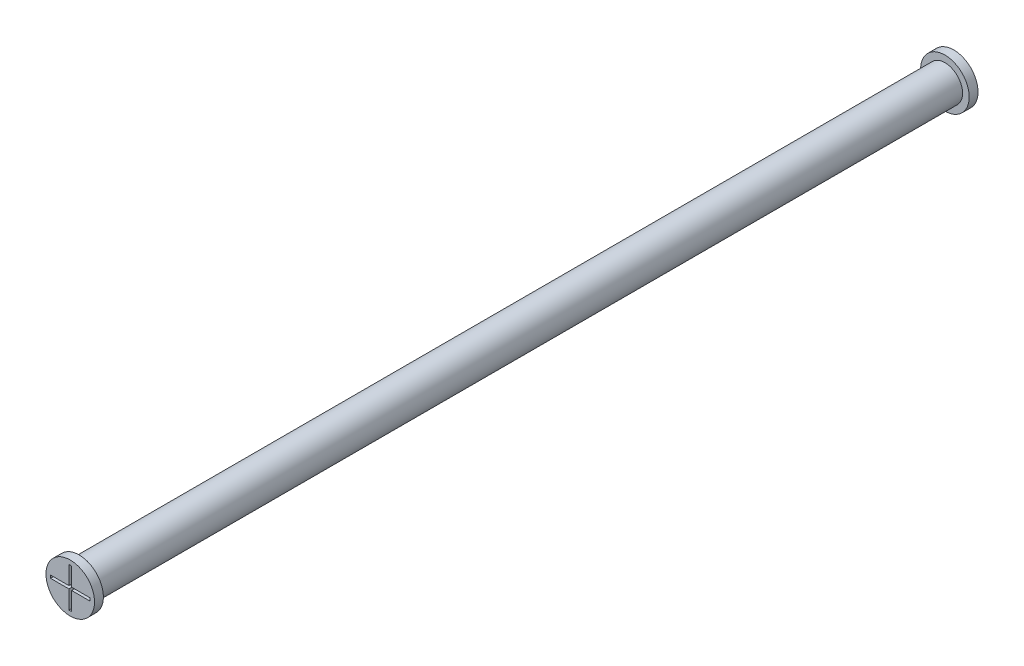
ISO-10303-21;
HEADER;
FILE_DESCRIPTION(('STEP AP214'),'2;1');
FILE_NAME('part.step','',(''),(''),'','','');
FILE_SCHEMA(('AUTOMOTIVE_DESIGN { 1 0 10303 214 1 1 1 1 }'));
ENDSEC;
DATA;
#1=APPLICATION_CONTEXT('core data for automotive mechanical design processes');
#2=APPLICATION_PROTOCOL_DEFINITION('international standard','automotive_design',2000,#1);
#3=PRODUCT_CONTEXT('',#1,'mechanical');
#4=PRODUCT('Part','Part','',(#3));
#5=PRODUCT_RELATED_PRODUCT_CATEGORY('part','',(#4));
#6=PRODUCT_DEFINITION_FORMATION('','',#4);
#7=PRODUCT_DEFINITION_CONTEXT('part definition',#1,'design');
#8=PRODUCT_DEFINITION('design','',#6,#7);
#9=PRODUCT_DEFINITION_SHAPE('','',#8);
#10=(LENGTH_UNIT() NAMED_UNIT(*) SI_UNIT(.MILLI.,.METRE.));
#11=(NAMED_UNIT(*) PLANE_ANGLE_UNIT() SI_UNIT($,.RADIAN.));
#12=(NAMED_UNIT(*) SI_UNIT($,.STERADIAN.) SOLID_ANGLE_UNIT());
#13=UNCERTAINTY_MEASURE_WITH_UNIT(LENGTH_MEASURE(1.E-05),#10,'distance_accuracy_value','');
#14=(GEOMETRIC_REPRESENTATION_CONTEXT(3) GLOBAL_UNCERTAINTY_ASSIGNED_CONTEXT((#13)) GLOBAL_UNIT_ASSIGNED_CONTEXT((#10,
#11,#12)) REPRESENTATION_CONTEXT('',''));
#15=CARTESIAN_POINT('',(0.,0.,0.));
#16=DIRECTION('',(0.,0.,1.));
#17=DIRECTION('',(1.,0.,0.));
#18=AXIS2_PLACEMENT_3D('',#15,#16,#17);
#19=CARTESIAN_POINT('',(0.,0.,98.));
#20=DIRECTION('',(0.,0.,-1.));
#21=DIRECTION('',(-1.,0.,0.));
#22=AXIS2_PLACEMENT_3D('',#19,#20,#21);
#23=CYLINDRICAL_SURFACE('',#22,2.);
#24=CARTESIAN_POINT('',(0.,0.,98.));
#25=DIRECTION('',(0.,0.,1.));
#26=DIRECTION('',(1.,0.,0.));
#27=AXIS2_PLACEMENT_3D('',#24,#25,#26);
#28=CIRCLE('',#27,2.);
#29=CARTESIAN_POINT('',(2.,0.,98.));
#30=VERTEX_POINT('',#29);
#31=EDGE_CURVE('E11',#30,#30,#28,.T.);
#32=ORIENTED_EDGE('',*,*,#31,.F.);
#33=EDGE_LOOP('',(#32));
#34=FACE_BOUND('',#33,.T.);
#35=CARTESIAN_POINT('',(0.,0.,0.));
#36=DIRECTION('',(0.,0.,-1.));
#37=DIRECTION('',(-1.,0.,0.));
#38=AXIS2_PLACEMENT_3D('',#35,#36,#37);
#39=CIRCLE('',#38,2.);
#40=CARTESIAN_POINT('',(-2.,0.,0.));
#41=VERTEX_POINT('',#40);
#42=EDGE_CURVE('E395',#41,#41,#39,.T.);
#43=ORIENTED_EDGE('',*,*,#42,.F.);
#44=EDGE_LOOP('',(#43));
#45=FACE_BOUND('',#44,.T.);
#46=ADVANCED_FACE('F35',(#34,#45),#23,.T.);
#47=CARTESIAN_POINT('',(0.,0.,99.));
#48=DIRECTION('',(0.,0.,-1.));
#49=DIRECTION('',(-1.,0.,0.));
#50=AXIS2_PLACEMENT_3D('',#47,#48,#49);
#51=CYLINDRICAL_SURFACE('',#50,2.75);
#52=CARTESIAN_POINT('',(0.,0.,99.));
#53=DIRECTION('',(0.,0.,1.));
#54=DIRECTION('',(1.,0.,0.));
#55=AXIS2_PLACEMENT_3D('',#52,#53,#54);
#56=CIRCLE('',#55,2.75);
#57=CARTESIAN_POINT('',(2.75,0.,99.));
#58=VERTEX_POINT('',#57);
#59=EDGE_CURVE('E42',#58,#58,#56,.T.);
#60=ORIENTED_EDGE('',*,*,#59,.F.);
#61=EDGE_LOOP('',(#60));
#62=FACE_BOUND('',#61,.T.);
#63=CARTESIAN_POINT('',(0.,0.,98.));
#64=DIRECTION('',(0.,0.,1.));
#65=DIRECTION('',(1.,0.,0.));
#66=AXIS2_PLACEMENT_3D('',#63,#64,#65);
#67=CIRCLE('',#66,2.75);
#68=CARTESIAN_POINT('',(2.75,0.,98.));
#69=VERTEX_POINT('',#68);
#70=EDGE_CURVE('E400',#69,#69,#67,.T.);
#71=ORIENTED_EDGE('',*,*,#70,.T.);
#72=EDGE_LOOP('',(#71));
#73=FACE_BOUND('',#72,.T.);
#74=ADVANCED_FACE('F405',(#62,#73),#51,.T.);
#75=CARTESIAN_POINT('',(0.,0.,99.));
#76=DIRECTION('',(0.,0.,1.));
#77=DIRECTION('',(1.,0.,0.));
#78=AXIS2_PLACEMENT_3D('',#75,#76,#77);
#79=PLANE('',#78);
#80=DIRECTION('',(0.,-1.,0.));
#81=VECTOR('',#80,1.);
#82=CARTESIAN_POINT('',(-0.154926193039241,-0.160877278986504,99.));
#83=LINE('',#82,#81);
#84=CARTESIAN_POINT('',(-0.154926193039241,-0.160877278986504,99.));
#85=VERTEX_POINT('',#84);
#86=CARTESIAN_POINT('',(-0.154926193039241,-2.23467552211787,99.));
#87=VERTEX_POINT('',#86);
#88=EDGE_CURVE('E49',#85,#87,#83,.T.);
#89=ORIENTED_EDGE('',*,*,#88,.F.);
#90=DIRECTION('',(1.,0.,0.));
#91=VECTOR('',#90,1.);
#92=CARTESIAN_POINT('',(-2.23467552211787,-0.160877278986504,99.));
#93=LINE('',#92,#91);
#94=CARTESIAN_POINT('',(-2.23467552211787,-0.160877278986504,99.));
#95=VERTEX_POINT('',#94);
#96=EDGE_CURVE('E216',#95,#85,#93,.T.);
#97=ORIENTED_EDGE('',*,*,#96,.F.);
#98=DIRECTION('',(0.,-1.,0.));
#99=VECTOR('',#98,1.);
#100=CARTESIAN_POINT('',(-2.23467552211787,0.160877278986504,99.));
#101=LINE('',#100,#99);
#102=CARTESIAN_POINT('',(-2.23467552211787,0.160877278986504,99.));
#103=VERTEX_POINT('',#102);
#104=EDGE_CURVE('E219',#103,#95,#101,.T.);
#105=ORIENTED_EDGE('',*,*,#104,.F.);
#106=DIRECTION('',(-1.,0.,0.));
#107=VECTOR('',#106,1.);
#108=CARTESIAN_POINT('',(-0.154926193039241,0.160877278986504,99.));
#109=LINE('',#108,#107);
#110=CARTESIAN_POINT('',(-0.154926193039241,0.160877278986504,99.));
#111=VERTEX_POINT('',#110);
#112=EDGE_CURVE('E271',#111,#103,#109,.T.);
#113=ORIENTED_EDGE('',*,*,#112,.F.);
#114=DIRECTION('',(0.,-1.,0.));
#115=VECTOR('',#114,1.);
#116=CARTESIAN_POINT('',(-0.154926193039241,2.23467552211787,99.));
#117=LINE('',#116,#115);
#118=CARTESIAN_POINT('',(-0.154926193039241,2.23467552211787,99.));
#119=VERTEX_POINT('',#118);
#120=EDGE_CURVE('E268',#119,#111,#117,.T.);
#121=ORIENTED_EDGE('',*,*,#120,.F.);
#122=DIRECTION('',(-1.,0.,0.));
#123=VECTOR('',#122,1.);
#124=CARTESIAN_POINT('',(0.154926193039241,2.23467552211787,99.));
#125=LINE('',#124,#123);
#126=CARTESIAN_POINT('',(0.154926193039241,2.23467552211787,99.));
#127=VERTEX_POINT('',#126);
#128=EDGE_CURVE('E265',#127,#119,#125,.T.);
#129=ORIENTED_EDGE('',*,*,#128,.F.);
#130=DIRECTION('',(0.,1.,0.));
#131=VECTOR('',#130,1.);
#132=CARTESIAN_POINT('',(0.154926193039241,0.160877278986504,99.));
#133=LINE('',#132,#131);
#134=CARTESIAN_POINT('',(0.154926193039241,0.160877278986504,99.));
#135=VERTEX_POINT('',#134);
#136=EDGE_CURVE('E262',#135,#127,#133,.T.);
#137=ORIENTED_EDGE('',*,*,#136,.F.);
#138=DIRECTION('',(-1.,0.,0.));
#139=VECTOR('',#138,1.);
#140=CARTESIAN_POINT('',(2.23467552211787,0.160877278986504,99.));
#141=LINE('',#140,#139);
#142=CARTESIAN_POINT('',(2.23467552211787,0.160877278986504,99.));
#143=VERTEX_POINT('',#142);
#144=EDGE_CURVE('E259',#143,#135,#141,.T.);
#145=ORIENTED_EDGE('',*,*,#144,.F.);
#146=DIRECTION('',(0.,1.,0.));
#147=VECTOR('',#146,1.);
#148=CARTESIAN_POINT('',(2.23467552211787,-0.160877278986504,99.));
#149=LINE('',#148,#147);
#150=CARTESIAN_POINT('',(2.23467552211787,-0.160877278986504,99.));
#151=VERTEX_POINT('',#150);
#152=EDGE_CURVE('E256',#151,#143,#149,.T.);
#153=ORIENTED_EDGE('',*,*,#152,.F.);
#154=DIRECTION('',(1.,0.,0.));
#155=VECTOR('',#154,1.);
#156=CARTESIAN_POINT('',(0.154926193039241,-0.160877278986504,99.));
#157=LINE('',#156,#155);
#158=CARTESIAN_POINT('',(0.154926193039241,-0.160877278986504,99.));
#159=VERTEX_POINT('',#158);
#160=EDGE_CURVE('E253',#159,#151,#157,.T.);
#161=ORIENTED_EDGE('',*,*,#160,.F.);
#162=DIRECTION('',(0.,1.,0.));
#163=VECTOR('',#162,1.);
#164=CARTESIAN_POINT('',(0.154926193039241,-2.23467552211787,99.));
#165=LINE('',#164,#163);
#166=CARTESIAN_POINT('',(0.154926193039241,-2.23467552211787,99.));
#167=VERTEX_POINT('',#166);
#168=EDGE_CURVE('E250',#167,#159,#165,.T.);
#169=ORIENTED_EDGE('',*,*,#168,.F.);
#170=DIRECTION('',(1.,0.,0.));
#171=VECTOR('',#170,1.);
#172=CARTESIAN_POINT('',(-0.154926193039241,-2.23467552211787,99.));
#173=LINE('',#172,#171);
#174=EDGE_CURVE('E248',#87,#167,#173,.T.);
#175=ORIENTED_EDGE('',*,*,#174,.F.);
#176=EDGE_LOOP('',(#89,#97,#105,#113,#121,#129,#137,#145,#153,#161,#169,#175));
#177=FACE_BOUND('',#176,.T.);
#178=ORIENTED_EDGE('',*,*,#59,.T.);
#179=EDGE_LOOP('',(#178));
#180=FACE_BOUND('',#179,.T.);
#181=ADVANCED_FACE('F410',(#177,#180),#79,.T.);
#182=CARTESIAN_POINT('',(0.,0.,98.));
#183=DIRECTION('',(0.,0.,1.));
#184=DIRECTION('',(1.,0.,0.));
#185=AXIS2_PLACEMENT_3D('',#182,#183,#184);
#186=PLANE('',#185);
#187=ORIENTED_EDGE('',*,*,#31,.T.);
#188=EDGE_LOOP('',(#187));
#189=FACE_BOUND('',#188,.T.);
#190=ORIENTED_EDGE('',*,*,#70,.F.);
#191=EDGE_LOOP('',(#190));
#192=FACE_BOUND('',#191,.T.);
#193=ADVANCED_FACE('F407',(#189,#192),#186,.F.);
#194=CARTESIAN_POINT('',(0.,0.,-1.));
#195=DIRECTION('',(0.,0.,1.));
#196=DIRECTION('',(1.,0.,0.));
#197=AXIS2_PLACEMENT_3D('',#194,#195,#196);
#198=CYLINDRICAL_SURFACE('',#197,2.75);
#199=CARTESIAN_POINT('',(0.,0.,-1.));
#200=DIRECTION('',(0.,0.,-1.));
#201=DIRECTION('',(-1.,0.,0.));
#202=AXIS2_PLACEMENT_3D('',#199,#200,#201);
#203=CIRCLE('',#202,2.75);
#204=CARTESIAN_POINT('',(-2.75,0.,-1.));
#205=VERTEX_POINT('',#204);
#206=EDGE_CURVE('E392',#205,#205,#203,.T.);
#207=ORIENTED_EDGE('',*,*,#206,.F.);
#208=EDGE_LOOP('',(#207));
#209=FACE_BOUND('',#208,.T.);
#210=CARTESIAN_POINT('',(0.,0.,0.));
#211=DIRECTION('',(0.,0.,-1.));
#212=DIRECTION('',(-1.,0.,0.));
#213=AXIS2_PLACEMENT_3D('',#210,#211,#212);
#214=CIRCLE('',#213,2.75);
#215=CARTESIAN_POINT('',(-2.75,0.,0.));
#216=VERTEX_POINT('',#215);
#217=EDGE_CURVE('E370',#216,#216,#214,.T.);
#218=ORIENTED_EDGE('',*,*,#217,.T.);
#219=EDGE_LOOP('',(#218));
#220=FACE_BOUND('',#219,.T.);
#221=ADVANCED_FACE('F409',(#209,#220),#198,.T.);
#222=CARTESIAN_POINT('',(0.,0.,-1.));
#223=DIRECTION('',(0.,0.,-1.));
#224=DIRECTION('',(-1.,0.,0.));
#225=AXIS2_PLACEMENT_3D('',#222,#223,#224);
#226=PLANE('',#225);
#227=DIRECTION('',(-1.,0.,0.));
#228=VECTOR('',#227,1.);
#229=CARTESIAN_POINT('',(-0.154926193039241,-0.160877278986504,-1.));
#230=LINE('',#229,#228);
#231=CARTESIAN_POINT('',(-0.154926193039241,-0.160877278986504,-1.));
#232=VERTEX_POINT('',#231);
#233=CARTESIAN_POINT('',(-2.23467552211787,-0.160877278986504,-1.));
#234=VERTEX_POINT('',#233);
#235=EDGE_CURVE('E57',#232,#234,#230,.T.);
#236=ORIENTED_EDGE('',*,*,#235,.F.);
#237=DIRECTION('',(0.,1.,0.));
#238=VECTOR('',#237,1.);
#239=CARTESIAN_POINT('',(-0.154926193039241,-0.160877278986504,-1.));
#240=LINE('',#239,#238);
#241=CARTESIAN_POINT('',(-0.154926193039241,-2.23467552211787,-1.));
#242=VERTEX_POINT('',#241);
#243=EDGE_CURVE('E301',#242,#232,#240,.T.);
#244=ORIENTED_EDGE('',*,*,#243,.F.);
#245=DIRECTION('',(-1.,0.,0.));
#246=VECTOR('',#245,1.);
#247=CARTESIAN_POINT('',(0.154926193039241,-2.23467552211787,-1.));
#248=LINE('',#247,#246);
#249=CARTESIAN_POINT('',(0.154926193039241,-2.23467552211787,-1.));
#250=VERTEX_POINT('',#249);
#251=EDGE_CURVE('E363',#250,#242,#248,.T.);
#252=ORIENTED_EDGE('',*,*,#251,.F.);
#253=DIRECTION('',(0.,-1.,0.));
#254=VECTOR('',#253,1.);
#255=CARTESIAN_POINT('',(0.154926193039241,-0.160877278986504,-1.));
#256=LINE('',#255,#254);
#257=CARTESIAN_POINT('',(0.154926193039241,-0.160877278986504,-1.));
#258=VERTEX_POINT('',#257);
#259=EDGE_CURVE('E360',#258,#250,#256,.T.);
#260=ORIENTED_EDGE('',*,*,#259,.F.);
#261=DIRECTION('',(-1.,0.,0.));
#262=VECTOR('',#261,1.);
#263=CARTESIAN_POINT('',(2.23467552211787,-0.160877278986504,-1.));
#264=LINE('',#263,#262);
#265=CARTESIAN_POINT('',(2.23467552211787,-0.160877278986504,-1.));
#266=VERTEX_POINT('',#265);
#267=EDGE_CURVE('E357',#266,#258,#264,.T.);
#268=ORIENTED_EDGE('',*,*,#267,.F.);
#269=DIRECTION('',(0.,-1.,0.));
#270=VECTOR('',#269,1.);
#271=CARTESIAN_POINT('',(2.23467552211787,0.160877278986504,-1.));
#272=LINE('',#271,#270);
#273=CARTESIAN_POINT('',(2.23467552211787,0.160877278986504,-1.));
#274=VERTEX_POINT('',#273);
#275=EDGE_CURVE('E354',#274,#266,#272,.T.);
#276=ORIENTED_EDGE('',*,*,#275,.F.);
#277=DIRECTION('',(1.,0.,0.));
#278=VECTOR('',#277,1.);
#279=CARTESIAN_POINT('',(2.23467552211787,0.160877278986504,-1.));
#280=LINE('',#279,#278);
#281=CARTESIAN_POINT('',(0.154926193039241,0.160877278986504,-1.));
#282=VERTEX_POINT('',#281);
#283=EDGE_CURVE('E351',#282,#274,#280,.T.);
#284=ORIENTED_EDGE('',*,*,#283,.F.);
#285=DIRECTION('',(0.,-1.,0.));
#286=VECTOR('',#285,1.);
#287=CARTESIAN_POINT('',(0.154926193039241,2.23467552211787,-1.));
#288=LINE('',#287,#286);
#289=CARTESIAN_POINT('',(0.154926193039241,2.23467552211787,-1.));
#290=VERTEX_POINT('',#289);
#291=EDGE_CURVE('E348',#290,#282,#288,.T.);
#292=ORIENTED_EDGE('',*,*,#291,.F.);
#293=DIRECTION('',(1.,0.,0.));
#294=VECTOR('',#293,1.);
#295=CARTESIAN_POINT('',(0.154926193039241,2.23467552211787,-1.));
#296=LINE('',#295,#294);
#297=CARTESIAN_POINT('',(-0.154926193039241,2.23467552211787,-1.));
#298=VERTEX_POINT('',#297);
#299=EDGE_CURVE('E345',#298,#290,#296,.T.);
#300=ORIENTED_EDGE('',*,*,#299,.F.);
#301=DIRECTION('',(0.,1.,0.));
#302=VECTOR('',#301,1.);
#303=CARTESIAN_POINT('',(-0.154926193039241,2.23467552211787,-1.));
#304=LINE('',#303,#302);
#305=CARTESIAN_POINT('',(-0.154926193039241,0.160877278986504,-1.));
#306=VERTEX_POINT('',#305);
#307=EDGE_CURVE('E342',#306,#298,#304,.T.);
#308=ORIENTED_EDGE('',*,*,#307,.F.);
#309=DIRECTION('',(1.,0.,0.));
#310=VECTOR('',#309,1.);
#311=CARTESIAN_POINT('',(-0.154926193039241,0.160877278986504,-1.));
#312=LINE('',#311,#310);
#313=CARTESIAN_POINT('',(-2.23467552211787,0.160877278986504,-1.));
#314=VERTEX_POINT('',#313);
#315=EDGE_CURVE('E339',#314,#306,#312,.T.);
#316=ORIENTED_EDGE('',*,*,#315,.F.);
#317=DIRECTION('',(0.,1.,0.));
#318=VECTOR('',#317,1.);
#319=CARTESIAN_POINT('',(-2.23467552211787,0.160877278986504,-1.));
#320=LINE('',#319,#318);
#321=EDGE_CURVE('E336',#234,#314,#320,.T.);
#322=ORIENTED_EDGE('',*,*,#321,.F.);
#323=EDGE_LOOP('',(#236,#244,#252,#260,#268,#276,#284,#292,#300,#308,#316,#322));
#324=FACE_BOUND('',#323,.T.);
#325=ORIENTED_EDGE('',*,*,#206,.T.);
#326=EDGE_LOOP('',(#325));
#327=FACE_BOUND('',#326,.T.);
#328=ADVANCED_FACE('F417',(#324,#327),#226,.T.);
#329=CARTESIAN_POINT('',(0.,0.,0.));
#330=DIRECTION('',(0.,0.,-1.));
#331=DIRECTION('',(-1.,0.,0.));
#332=AXIS2_PLACEMENT_3D('',#329,#330,#331);
#333=PLANE('',#332);
#334=ORIENTED_EDGE('',*,*,#42,.T.);
#335=EDGE_LOOP('',(#334));
#336=FACE_BOUND('',#335,.T.);
#337=ORIENTED_EDGE('',*,*,#217,.F.);
#338=EDGE_LOOP('',(#337));
#339=FACE_BOUND('',#338,.T.);
#340=ADVANCED_FACE('F432',(#336,#339),#333,.F.);
#341=CARTESIAN_POINT('',(-0.154926193039241,-0.160877278986504,-0.5));
#342=DIRECTION('',(0.,-1.,0.));
#343=DIRECTION('',(0.,0.,-1.));
#344=AXIS2_PLACEMENT_3D('',#341,#342,#343);
#345=PLANE('',#344);
#346=ORIENTED_EDGE('',*,*,#235,.T.);
#347=DIRECTION('',(0.,0.,-1.));
#348=VECTOR('',#347,1.);
#349=CARTESIAN_POINT('',(-2.23467552211787,-0.160877278986504,-0.5));
#350=LINE('',#349,#348);
#351=CARTESIAN_POINT('',(-2.23467552211787,-0.160877278986504,-0.5));
#352=VERTEX_POINT('',#351);
#353=EDGE_CURVE('E334',#352,#234,#350,.T.);
#354=ORIENTED_EDGE('',*,*,#353,.F.);
#355=DIRECTION('',(-1.,0.,0.));
#356=VECTOR('',#355,1.);
#357=CARTESIAN_POINT('',(-0.154926193039241,-0.160877278986504,-0.5));
#358=LINE('',#357,#356);
#359=CARTESIAN_POINT('',(-0.154926193039241,-0.160877278986504,-0.5));
#360=VERTEX_POINT('',#359);
#361=EDGE_CURVE('E297',#360,#352,#358,.T.);
#362=ORIENTED_EDGE('',*,*,#361,.F.);
#363=DIRECTION('',(0.,0.,-1.));
#364=VECTOR('',#363,1.);
#365=CARTESIAN_POINT('',(-0.154926193039241,-0.160877278986504,-0.5));
#366=LINE('',#365,#364);
#367=EDGE_CURVE('E368',#360,#232,#366,.T.);
#368=ORIENTED_EDGE('',*,*,#367,.T.);
#369=EDGE_LOOP('',(#346,#354,#362,#368));
#370=FACE_BOUND('',#369,.T.);
#371=ADVANCED_FACE('F435',(#370),#345,.F.);
#372=CARTESIAN_POINT('',(-0.154926193039241,-0.160877278986504,-0.5));
#373=DIRECTION('',(-1.,0.,0.));
#374=DIRECTION('',(0.,-1.,0.));
#375=AXIS2_PLACEMENT_3D('',#372,#373,#374);
#376=PLANE('',#375);
#377=ORIENTED_EDGE('',*,*,#243,.T.);
#378=ORIENTED_EDGE('',*,*,#367,.F.);
#379=DIRECTION('',(0.,1.,0.));
#380=VECTOR('',#379,1.);
#381=CARTESIAN_POINT('',(-0.154926193039241,-0.160877278986504,-0.5));
#382=LINE('',#381,#380);
#383=CARTESIAN_POINT('',(-0.154926193039241,-2.23467552211787,-0.5));
#384=VERTEX_POINT('',#383);
#385=EDGE_CURVE('E331',#384,#360,#382,.T.);
#386=ORIENTED_EDGE('',*,*,#385,.F.);
#387=DIRECTION('',(0.,0.,-1.));
#388=VECTOR('',#387,1.);
#389=CARTESIAN_POINT('',(-0.154926193039241,-2.23467552211787,-0.5));
#390=LINE('',#389,#388);
#391=EDGE_CURVE('E371',#384,#242,#390,.T.);
#392=ORIENTED_EDGE('',*,*,#391,.T.);
#393=EDGE_LOOP('',(#377,#378,#386,#392));
#394=FACE_BOUND('',#393,.T.);
#395=ADVANCED_FACE('F443',(#394),#376,.F.);
#396=CARTESIAN_POINT('',(0.154926193039241,-2.23467552211787,-0.5));
#397=DIRECTION('',(0.,-1.,0.));
#398=DIRECTION('',(0.,0.,-1.));
#399=AXIS2_PLACEMENT_3D('',#396,#397,#398);
#400=PLANE('',#399);
#401=ORIENTED_EDGE('',*,*,#251,.T.);
#402=ORIENTED_EDGE('',*,*,#391,.F.);
#403=DIRECTION('',(-1.,0.,0.));
#404=VECTOR('',#403,1.);
#405=CARTESIAN_POINT('',(0.154926193039241,-2.23467552211787,-0.5));
#406=LINE('',#405,#404);
#407=CARTESIAN_POINT('',(0.154926193039241,-2.23467552211787,-0.5));
#408=VERTEX_POINT('',#407);
#409=EDGE_CURVE('E328',#408,#384,#406,.T.);
#410=ORIENTED_EDGE('',*,*,#409,.F.);
#411=DIRECTION('',(0.,0.,-1.));
#412=VECTOR('',#411,1.);
#413=CARTESIAN_POINT('',(0.154926193039241,-2.23467552211787,-0.5));
#414=LINE('',#413,#412);
#415=EDGE_CURVE('E373',#408,#250,#414,.T.);
#416=ORIENTED_EDGE('',*,*,#415,.T.);
#417=EDGE_LOOP('',(#401,#402,#410,#416));
#418=FACE_BOUND('',#417,.T.);
#419=ADVANCED_FACE('F484',(#418),#400,.F.);
#420=CARTESIAN_POINT('',(0.154926193039241,-0.160877278986504,-0.5));
#421=DIRECTION('',(1.,0.,0.));
#422=DIRECTION('',(0.,1.,0.));
#423=AXIS2_PLACEMENT_3D('',#420,#421,#422);
#424=PLANE('',#423);
#425=ORIENTED_EDGE('',*,*,#259,.T.);
#426=ORIENTED_EDGE('',*,*,#415,.F.);
#427=DIRECTION('',(0.,-1.,0.));
#428=VECTOR('',#427,1.);
#429=CARTESIAN_POINT('',(0.154926193039241,-0.160877278986504,-0.5));
#430=LINE('',#429,#428);
#431=CARTESIAN_POINT('',(0.154926193039241,-0.160877278986504,-0.5));
#432=VERTEX_POINT('',#431);
#433=EDGE_CURVE('E325',#432,#408,#430,.T.);
#434=ORIENTED_EDGE('',*,*,#433,.F.);
#435=DIRECTION('',(0.,0.,-1.));
#436=VECTOR('',#435,1.);
#437=CARTESIAN_POINT('',(0.154926193039241,-0.160877278986504,-0.5));
#438=LINE('',#437,#436);
#439=EDGE_CURVE('E375',#432,#258,#438,.T.);
#440=ORIENTED_EDGE('',*,*,#439,.T.);
#441=EDGE_LOOP('',(#425,#426,#434,#440));
#442=FACE_BOUND('',#441,.T.);
#443=ADVANCED_FACE('F480',(#442),#424,.F.);
#444=CARTESIAN_POINT('',(2.23467552211787,-0.160877278986504,-0.5));
#445=DIRECTION('',(0.,-1.,0.));
#446=DIRECTION('',(0.,0.,-1.));
#447=AXIS2_PLACEMENT_3D('',#444,#445,#446);
#448=PLANE('',#447);
#449=ORIENTED_EDGE('',*,*,#267,.T.);
#450=ORIENTED_EDGE('',*,*,#439,.F.);
#451=DIRECTION('',(-1.,0.,0.));
#452=VECTOR('',#451,1.);
#453=CARTESIAN_POINT('',(2.23467552211787,-0.160877278986504,-0.5));
#454=LINE('',#453,#452);
#455=CARTESIAN_POINT('',(2.23467552211787,-0.160877278986504,-0.5));
#456=VERTEX_POINT('',#455);
#457=EDGE_CURVE('E322',#456,#432,#454,.T.);
#458=ORIENTED_EDGE('',*,*,#457,.F.);
#459=DIRECTION('',(0.,0.,-1.));
#460=VECTOR('',#459,1.);
#461=CARTESIAN_POINT('',(2.23467552211787,-0.160877278986504,-0.5));
#462=LINE('',#461,#460);
#463=EDGE_CURVE('E377',#456,#266,#462,.T.);
#464=ORIENTED_EDGE('',*,*,#463,.T.);
#465=EDGE_LOOP('',(#449,#450,#458,#464));
#466=FACE_BOUND('',#465,.T.);
#467=ADVANCED_FACE('F476',(#466),#448,.F.);
#468=CARTESIAN_POINT('',(2.23467552211787,0.160877278986504,-0.5));
#469=DIRECTION('',(1.,0.,0.));
#470=DIRECTION('',(0.,0.,-1.));
#471=AXIS2_PLACEMENT_3D('',#468,#469,#470);
#472=PLANE('',#471);
#473=ORIENTED_EDGE('',*,*,#275,.T.);
#474=ORIENTED_EDGE('',*,*,#463,.F.);
#475=DIRECTION('',(0.,-1.,0.));
#476=VECTOR('',#475,1.);
#477=CARTESIAN_POINT('',(2.23467552211787,0.160877278986504,-0.5));
#478=LINE('',#477,#476);
#479=CARTESIAN_POINT('',(2.23467552211787,0.160877278986504,-0.5));
#480=VERTEX_POINT('',#479);
#481=EDGE_CURVE('E319',#480,#456,#478,.T.);
#482=ORIENTED_EDGE('',*,*,#481,.F.);
#483=DIRECTION('',(0.,0.,-1.));
#484=VECTOR('',#483,1.);
#485=CARTESIAN_POINT('',(2.23467552211787,0.160877278986504,-0.5));
#486=LINE('',#485,#484);
#487=EDGE_CURVE('E379',#480,#274,#486,.T.);
#488=ORIENTED_EDGE('',*,*,#487,.T.);
#489=EDGE_LOOP('',(#473,#474,#482,#488));
#490=FACE_BOUND('',#489,.T.);
#491=ADVANCED_FACE('F472',(#490),#472,.F.);
#492=CARTESIAN_POINT('',(2.23467552211787,0.160877278986504,-0.5));
#493=DIRECTION('',(0.,1.,0.));
#494=DIRECTION('',(0.,0.,1.));
#495=AXIS2_PLACEMENT_3D('',#492,#493,#494);
#496=PLANE('',#495);
#497=ORIENTED_EDGE('',*,*,#283,.T.);
#498=ORIENTED_EDGE('',*,*,#487,.F.);
#499=DIRECTION('',(1.,0.,0.));
#500=VECTOR('',#499,1.);
#501=CARTESIAN_POINT('',(2.23467552211787,0.160877278986504,-0.5));
#502=LINE('',#501,#500);
#503=CARTESIAN_POINT('',(0.154926193039241,0.160877278986504,-0.5));
#504=VERTEX_POINT('',#503);
#505=EDGE_CURVE('E316',#504,#480,#502,.T.);
#506=ORIENTED_EDGE('',*,*,#505,.F.);
#507=DIRECTION('',(0.,0.,-1.));
#508=VECTOR('',#507,1.);
#509=CARTESIAN_POINT('',(0.154926193039241,0.160877278986504,-0.5));
#510=LINE('',#509,#508);
#511=EDGE_CURVE('E381',#504,#282,#510,.T.);
#512=ORIENTED_EDGE('',*,*,#511,.T.);
#513=EDGE_LOOP('',(#497,#498,#506,#512));
#514=FACE_BOUND('',#513,.T.);
#515=ADVANCED_FACE('F468',(#514),#496,.F.);
#516=CARTESIAN_POINT('',(0.154926193039241,2.23467552211787,-0.5));
#517=DIRECTION('',(1.,0.,0.));
#518=DIRECTION('',(0.,1.,0.));
#519=AXIS2_PLACEMENT_3D('',#516,#517,#518);
#520=PLANE('',#519);
#521=ORIENTED_EDGE('',*,*,#291,.T.);
#522=ORIENTED_EDGE('',*,*,#511,.F.);
#523=DIRECTION('',(0.,-1.,0.));
#524=VECTOR('',#523,1.);
#525=CARTESIAN_POINT('',(0.154926193039241,2.23467552211787,-0.5));
#526=LINE('',#525,#524);
#527=CARTESIAN_POINT('',(0.154926193039241,2.23467552211787,-0.5));
#528=VERTEX_POINT('',#527);
#529=EDGE_CURVE('E313',#528,#504,#526,.T.);
#530=ORIENTED_EDGE('',*,*,#529,.F.);
#531=DIRECTION('',(0.,0.,-1.));
#532=VECTOR('',#531,1.);
#533=CARTESIAN_POINT('',(0.154926193039241,2.23467552211787,-0.5));
#534=LINE('',#533,#532);
#535=EDGE_CURVE('E383',#528,#290,#534,.T.);
#536=ORIENTED_EDGE('',*,*,#535,.T.);
#537=EDGE_LOOP('',(#521,#522,#530,#536));
#538=FACE_BOUND('',#537,.T.);
#539=ADVANCED_FACE('F464',(#538),#520,.F.);
#540=CARTESIAN_POINT('',(0.154926193039241,2.23467552211787,-0.5));
#541=DIRECTION('',(0.,1.,0.));
#542=DIRECTION('',(0.,0.,1.));
#543=AXIS2_PLACEMENT_3D('',#540,#541,#542);
#544=PLANE('',#543);
#545=ORIENTED_EDGE('',*,*,#299,.T.);
#546=ORIENTED_EDGE('',*,*,#535,.F.);
#547=DIRECTION('',(1.,0.,0.));
#548=VECTOR('',#547,1.);
#549=CARTESIAN_POINT('',(0.154926193039241,2.23467552211787,-0.5));
#550=LINE('',#549,#548);
#551=CARTESIAN_POINT('',(-0.154926193039241,2.23467552211787,-0.5));
#552=VERTEX_POINT('',#551);
#553=EDGE_CURVE('E310',#552,#528,#550,.T.);
#554=ORIENTED_EDGE('',*,*,#553,.F.);
#555=DIRECTION('',(0.,0.,-1.));
#556=VECTOR('',#555,1.);
#557=CARTESIAN_POINT('',(-0.154926193039241,2.23467552211787,-0.5));
#558=LINE('',#557,#556);
#559=EDGE_CURVE('E385',#552,#298,#558,.T.);
#560=ORIENTED_EDGE('',*,*,#559,.T.);
#561=EDGE_LOOP('',(#545,#546,#554,#560));
#562=FACE_BOUND('',#561,.T.);
#563=ADVANCED_FACE('F460',(#562),#544,.F.);
#564=CARTESIAN_POINT('',(-0.154926193039241,2.23467552211787,-0.5));
#565=DIRECTION('',(-1.,0.,0.));
#566=DIRECTION('',(0.,-1.,0.));
#567=AXIS2_PLACEMENT_3D('',#564,#565,#566);
#568=PLANE('',#567);
#569=ORIENTED_EDGE('',*,*,#307,.T.);
#570=ORIENTED_EDGE('',*,*,#559,.F.);
#571=DIRECTION('',(0.,1.,0.));
#572=VECTOR('',#571,1.);
#573=CARTESIAN_POINT('',(-0.154926193039241,2.23467552211787,-0.5));
#574=LINE('',#573,#572);
#575=CARTESIAN_POINT('',(-0.154926193039241,0.160877278986504,-0.5));
#576=VERTEX_POINT('',#575);
#577=EDGE_CURVE('E307',#576,#552,#574,.T.);
#578=ORIENTED_EDGE('',*,*,#577,.F.);
#579=DIRECTION('',(0.,0.,-1.));
#580=VECTOR('',#579,1.);
#581=CARTESIAN_POINT('',(-0.154926193039241,0.160877278986504,-0.5));
#582=LINE('',#581,#580);
#583=EDGE_CURVE('E387',#576,#306,#582,.T.);
#584=ORIENTED_EDGE('',*,*,#583,.T.);
#585=EDGE_LOOP('',(#569,#570,#578,#584));
#586=FACE_BOUND('',#585,.T.);
#587=ADVANCED_FACE('F456',(#586),#568,.F.);
#588=CARTESIAN_POINT('',(-0.154926193039241,0.160877278986504,-0.5));
#589=DIRECTION('',(0.,1.,0.));
#590=DIRECTION('',(0.,0.,1.));
#591=AXIS2_PLACEMENT_3D('',#588,#589,#590);
#592=PLANE('',#591);
#593=ORIENTED_EDGE('',*,*,#315,.T.);
#594=ORIENTED_EDGE('',*,*,#583,.F.);
#595=DIRECTION('',(1.,0.,0.));
#596=VECTOR('',#595,1.);
#597=CARTESIAN_POINT('',(-0.154926193039241,0.160877278986504,-0.5));
#598=LINE('',#597,#596);
#599=CARTESIAN_POINT('',(-2.23467552211787,0.160877278986504,-0.5));
#600=VERTEX_POINT('',#599);
#601=EDGE_CURVE('E304',#600,#576,#598,.T.);
#602=ORIENTED_EDGE('',*,*,#601,.F.);
#603=DIRECTION('',(0.,0.,-1.));
#604=VECTOR('',#603,1.);
#605=CARTESIAN_POINT('',(-2.23467552211787,0.160877278986504,-0.5));
#606=LINE('',#605,#604);
#607=EDGE_CURVE('E389',#600,#314,#606,.T.);
#608=ORIENTED_EDGE('',*,*,#607,.T.);
#609=EDGE_LOOP('',(#593,#594,#602,#608));
#610=FACE_BOUND('',#609,.T.);
#611=ADVANCED_FACE('F452',(#610),#592,.F.);
#612=CARTESIAN_POINT('',(-2.23467552211787,0.160877278986504,-0.5));
#613=DIRECTION('',(-1.,0.,0.));
#614=DIRECTION('',(0.,0.,1.));
#615=AXIS2_PLACEMENT_3D('',#612,#613,#614);
#616=PLANE('',#615);
#617=ORIENTED_EDGE('',*,*,#321,.T.);
#618=ORIENTED_EDGE('',*,*,#607,.F.);
#619=DIRECTION('',(0.,1.,0.));
#620=VECTOR('',#619,1.);
#621=CARTESIAN_POINT('',(-2.23467552211787,0.160877278986504,-0.5));
#622=LINE('',#621,#620);
#623=EDGE_CURVE('E300',#352,#600,#622,.T.);
#624=ORIENTED_EDGE('',*,*,#623,.F.);
#625=ORIENTED_EDGE('',*,*,#353,.T.);
#626=EDGE_LOOP('',(#617,#618,#624,#625));
#627=FACE_BOUND('',#626,.T.);
#628=ADVANCED_FACE('F448',(#627),#616,.F.);
#629=CARTESIAN_POINT('',(0.,0.,-0.5));
#630=DIRECTION('',(0.,0.,1.));
#631=DIRECTION('',(1.,0.,0.));
#632=AXIS2_PLACEMENT_3D('',#629,#630,#631);
#633=PLANE('',#632);
#634=ORIENTED_EDGE('',*,*,#361,.T.);
#635=ORIENTED_EDGE('',*,*,#623,.T.);
#636=ORIENTED_EDGE('',*,*,#601,.T.);
#637=ORIENTED_EDGE('',*,*,#577,.T.);
#638=ORIENTED_EDGE('',*,*,#553,.T.);
#639=ORIENTED_EDGE('',*,*,#529,.T.);
#640=ORIENTED_EDGE('',*,*,#505,.T.);
#641=ORIENTED_EDGE('',*,*,#481,.T.);
#642=ORIENTED_EDGE('',*,*,#457,.T.);
#643=ORIENTED_EDGE('',*,*,#433,.T.);
#644=ORIENTED_EDGE('',*,*,#409,.T.);
#645=ORIENTED_EDGE('',*,*,#385,.T.);
#646=EDGE_LOOP('',(#634,#635,#636,#637,#638,#639,#640,#641,#642,#643,#644,#645));
#647=FACE_BOUND('',#646,.T.);
#648=ADVANCED_FACE('F451',(#647),#633,.F.);
#649=CARTESIAN_POINT('',(-0.154926193039241,-0.160877278986504,98.5));
#650=DIRECTION('',(-1.,0.,0.));
#651=DIRECTION('',(0.,-1.,0.));
#652=AXIS2_PLACEMENT_3D('',#649,#650,#651);
#653=PLANE('',#652);
#654=ORIENTED_EDGE('',*,*,#88,.T.);
#655=DIRECTION('',(0.,0.,1.));
#656=VECTOR('',#655,1.);
#657=CARTESIAN_POINT('',(-0.154926193039241,-2.23467552211787,98.5));
#658=LINE('',#657,#656);
#659=CARTESIAN_POINT('',(-0.154926193039241,-2.23467552211787,98.5));
#660=VERTEX_POINT('',#659);
#661=EDGE_CURVE('E193',#660,#87,#658,.T.);
#662=ORIENTED_EDGE('',*,*,#661,.F.);
#663=DIRECTION('',(0.,-1.,0.));
#664=VECTOR('',#663,1.);
#665=CARTESIAN_POINT('',(-0.154926193039241,-0.160877278986504,98.5));
#666=LINE('',#665,#664);
#667=CARTESIAN_POINT('',(-0.154926193039241,-0.160877278986504,98.5));
#668=VERTEX_POINT('',#667);
#669=EDGE_CURVE('E197',#668,#660,#666,.T.);
#670=ORIENTED_EDGE('',*,*,#669,.F.);
#671=DIRECTION('',(0.,0.,1.));
#672=VECTOR('',#671,1.);
#673=CARTESIAN_POINT('',(-0.154926193039241,-0.160877278986504,98.5));
#674=LINE('',#673,#672);
#675=EDGE_CURVE('E276',#668,#85,#674,.T.);
#676=ORIENTED_EDGE('',*,*,#675,.T.);
#677=EDGE_LOOP('',(#654,#662,#670,#676));
#678=FACE_BOUND('',#677,.T.);
#679=ADVANCED_FACE('F195',(#678),#653,.F.);
#680=CARTESIAN_POINT('',(-2.23467552211787,-0.160877278986504,98.5));
#681=DIRECTION('',(0.,-1.,0.));
#682=DIRECTION('',(0.,0.,-1.));
#683=AXIS2_PLACEMENT_3D('',#680,#681,#682);
#684=PLANE('',#683);
#685=ORIENTED_EDGE('',*,*,#96,.T.);
#686=ORIENTED_EDGE('',*,*,#675,.F.);
#687=DIRECTION('',(1.,0.,0.));
#688=VECTOR('',#687,1.);
#689=CARTESIAN_POINT('',(-2.23467552211787,-0.160877278986504,98.5));
#690=LINE('',#689,#688);
#691=CARTESIAN_POINT('',(-2.23467552211787,-0.160877278986504,98.5));
#692=VERTEX_POINT('',#691);
#693=EDGE_CURVE('E203',#692,#668,#690,.T.);
#694=ORIENTED_EDGE('',*,*,#693,.F.);
#695=DIRECTION('',(0.,0.,1.));
#696=VECTOR('',#695,1.);
#697=CARTESIAN_POINT('',(-2.23467552211787,-0.160877278986504,98.5));
#698=LINE('',#697,#696);
#699=EDGE_CURVE('E278',#692,#95,#698,.T.);
#700=ORIENTED_EDGE('',*,*,#699,.T.);
#701=EDGE_LOOP('',(#685,#686,#694,#700));
#702=FACE_BOUND('',#701,.T.);
#703=ADVANCED_FACE('F497',(#702),#684,.F.);
#704=CARTESIAN_POINT('',(-2.23467552211787,0.160877278986504,98.5));
#705=DIRECTION('',(-1.,0.,0.));
#706=DIRECTION('',(0.,0.,1.));
#707=AXIS2_PLACEMENT_3D('',#704,#705,#706);
#708=PLANE('',#707);
#709=ORIENTED_EDGE('',*,*,#104,.T.);
#710=ORIENTED_EDGE('',*,*,#699,.F.);
#711=DIRECTION('',(0.,-1.,0.));
#712=VECTOR('',#711,1.);
#713=CARTESIAN_POINT('',(-2.23467552211787,0.160877278986504,98.5));
#714=LINE('',#713,#712);
#715=CARTESIAN_POINT('',(-2.23467552211787,0.160877278986504,98.5));
#716=VERTEX_POINT('',#715);
#717=EDGE_CURVE('E244',#716,#692,#714,.T.);
#718=ORIENTED_EDGE('',*,*,#717,.F.);
#719=DIRECTION('',(0.,0.,1.));
#720=VECTOR('',#719,1.);
#721=CARTESIAN_POINT('',(-2.23467552211787,0.160877278986504,98.5));
#722=LINE('',#721,#720);
#723=EDGE_CURVE('E280',#716,#103,#722,.T.);
#724=ORIENTED_EDGE('',*,*,#723,.T.);
#725=EDGE_LOOP('',(#709,#710,#718,#724));
#726=FACE_BOUND('',#725,.T.);
#727=ADVANCED_FACE('F531',(#726),#708,.F.);
#728=CARTESIAN_POINT('',(-0.154926193039241,0.160877278986504,98.5));
#729=DIRECTION('',(0.,1.,0.));
#730=DIRECTION('',(0.,0.,1.));
#731=AXIS2_PLACEMENT_3D('',#728,#729,#730);
#732=PLANE('',#731);
#733=ORIENTED_EDGE('',*,*,#112,.T.);
#734=ORIENTED_EDGE('',*,*,#723,.F.);
#735=DIRECTION('',(-1.,0.,0.));
#736=VECTOR('',#735,1.);
#737=CARTESIAN_POINT('',(-0.154926193039241,0.160877278986504,98.5));
#738=LINE('',#737,#736);
#739=CARTESIAN_POINT('',(-0.154926193039241,0.160877278986504,98.5));
#740=VERTEX_POINT('',#739);
#741=EDGE_CURVE('E241',#740,#716,#738,.T.);
#742=ORIENTED_EDGE('',*,*,#741,.F.);
#743=DIRECTION('',(0.,0.,1.));
#744=VECTOR('',#743,1.);
#745=CARTESIAN_POINT('',(-0.154926193039241,0.160877278986504,98.5));
#746=LINE('',#745,#744);
#747=EDGE_CURVE('E282',#740,#111,#746,.T.);
#748=ORIENTED_EDGE('',*,*,#747,.T.);
#749=EDGE_LOOP('',(#733,#734,#742,#748));
#750=FACE_BOUND('',#749,.T.);
#751=ADVANCED_FACE('F527',(#750),#732,.F.);
#752=CARTESIAN_POINT('',(-0.154926193039241,2.23467552211787,98.5));
#753=DIRECTION('',(-1.,0.,0.));
#754=DIRECTION('',(0.,-1.,0.));
#755=AXIS2_PLACEMENT_3D('',#752,#753,#754);
#756=PLANE('',#755);
#757=ORIENTED_EDGE('',*,*,#120,.T.);
#758=ORIENTED_EDGE('',*,*,#747,.F.);
#759=DIRECTION('',(0.,-1.,0.));
#760=VECTOR('',#759,1.);
#761=CARTESIAN_POINT('',(-0.154926193039241,2.23467552211787,98.5));
#762=LINE('',#761,#760);
#763=CARTESIAN_POINT('',(-0.154926193039241,2.23467552211787,98.5));
#764=VERTEX_POINT('',#763);
#765=EDGE_CURVE('E238',#764,#740,#762,.T.);
#766=ORIENTED_EDGE('',*,*,#765,.F.);
#767=DIRECTION('',(0.,0.,1.));
#768=VECTOR('',#767,1.);
#769=CARTESIAN_POINT('',(-0.154926193039241,2.23467552211787,98.5));
#770=LINE('',#769,#768);
#771=EDGE_CURVE('E284',#764,#119,#770,.T.);
#772=ORIENTED_EDGE('',*,*,#771,.T.);
#773=EDGE_LOOP('',(#757,#758,#766,#772));
#774=FACE_BOUND('',#773,.T.);
#775=ADVANCED_FACE('F523',(#774),#756,.F.);
#776=CARTESIAN_POINT('',(0.154926193039241,2.23467552211787,98.5));
#777=DIRECTION('',(0.,1.,0.));
#778=DIRECTION('',(0.,0.,1.));
#779=AXIS2_PLACEMENT_3D('',#776,#777,#778);
#780=PLANE('',#779);
#781=ORIENTED_EDGE('',*,*,#128,.T.);
#782=ORIENTED_EDGE('',*,*,#771,.F.);
#783=DIRECTION('',(-1.,0.,0.));
#784=VECTOR('',#783,1.);
#785=CARTESIAN_POINT('',(0.154926193039241,2.23467552211787,98.5));
#786=LINE('',#785,#784);
#787=CARTESIAN_POINT('',(0.154926193039241,2.23467552211787,98.5));
#788=VERTEX_POINT('',#787);
#789=EDGE_CURVE('E235',#788,#764,#786,.T.);
#790=ORIENTED_EDGE('',*,*,#789,.F.);
#791=DIRECTION('',(0.,0.,1.));
#792=VECTOR('',#791,1.);
#793=CARTESIAN_POINT('',(0.154926193039241,2.23467552211787,98.5));
#794=LINE('',#793,#792);
#795=EDGE_CURVE('E286',#788,#127,#794,.T.);
#796=ORIENTED_EDGE('',*,*,#795,.T.);
#797=EDGE_LOOP('',(#781,#782,#790,#796));
#798=FACE_BOUND('',#797,.T.);
#799=ADVANCED_FACE('F519',(#798),#780,.F.);
#800=CARTESIAN_POINT('',(0.154926193039241,0.160877278986504,98.5));
#801=DIRECTION('',(1.,0.,0.));
#802=DIRECTION('',(0.,1.,0.));
#803=AXIS2_PLACEMENT_3D('',#800,#801,#802);
#804=PLANE('',#803);
#805=ORIENTED_EDGE('',*,*,#136,.T.);
#806=ORIENTED_EDGE('',*,*,#795,.F.);
#807=DIRECTION('',(0.,1.,0.));
#808=VECTOR('',#807,1.);
#809=CARTESIAN_POINT('',(0.154926193039241,0.160877278986504,98.5));
#810=LINE('',#809,#808);
#811=CARTESIAN_POINT('',(0.154926193039241,0.160877278986504,98.5));
#812=VERTEX_POINT('',#811);
#813=EDGE_CURVE('E232',#812,#788,#810,.T.);
#814=ORIENTED_EDGE('',*,*,#813,.F.);
#815=DIRECTION('',(0.,0.,1.));
#816=VECTOR('',#815,1.);
#817=CARTESIAN_POINT('',(0.154926193039241,0.160877278986504,98.5));
#818=LINE('',#817,#816);
#819=EDGE_CURVE('E288',#812,#135,#818,.T.);
#820=ORIENTED_EDGE('',*,*,#819,.T.);
#821=EDGE_LOOP('',(#805,#806,#814,#820));
#822=FACE_BOUND('',#821,.T.);
#823=ADVANCED_FACE('F515',(#822),#804,.F.);
#824=CARTESIAN_POINT('',(2.23467552211787,0.160877278986504,98.5));
#825=DIRECTION('',(0.,1.,0.));
#826=DIRECTION('',(0.,0.,1.));
#827=AXIS2_PLACEMENT_3D('',#824,#825,#826);
#828=PLANE('',#827);
#829=ORIENTED_EDGE('',*,*,#144,.T.);
#830=ORIENTED_EDGE('',*,*,#819,.F.);
#831=DIRECTION('',(-1.,0.,0.));
#832=VECTOR('',#831,1.);
#833=CARTESIAN_POINT('',(2.23467552211787,0.160877278986504,98.5));
#834=LINE('',#833,#832);
#835=CARTESIAN_POINT('',(2.23467552211787,0.160877278986504,98.5));
#836=VERTEX_POINT('',#835);
#837=EDGE_CURVE('E229',#836,#812,#834,.T.);
#838=ORIENTED_EDGE('',*,*,#837,.F.);
#839=DIRECTION('',(0.,0.,1.));
#840=VECTOR('',#839,1.);
#841=CARTESIAN_POINT('',(2.23467552211787,0.160877278986504,98.5));
#842=LINE('',#841,#840);
#843=EDGE_CURVE('E290',#836,#143,#842,.T.);
#844=ORIENTED_EDGE('',*,*,#843,.T.);
#845=EDGE_LOOP('',(#829,#830,#838,#844));
#846=FACE_BOUND('',#845,.T.);
#847=ADVANCED_FACE('F511',(#846),#828,.F.);
#848=CARTESIAN_POINT('',(2.23467552211787,-0.160877278986504,98.5));
#849=DIRECTION('',(1.,0.,0.));
#850=DIRECTION('',(0.,0.,-1.));
#851=AXIS2_PLACEMENT_3D('',#848,#849,#850);
#852=PLANE('',#851);
#853=ORIENTED_EDGE('',*,*,#152,.T.);
#854=ORIENTED_EDGE('',*,*,#843,.F.);
#855=DIRECTION('',(0.,1.,0.));
#856=VECTOR('',#855,1.);
#857=CARTESIAN_POINT('',(2.23467552211787,-0.160877278986504,98.5));
#858=LINE('',#857,#856);
#859=CARTESIAN_POINT('',(2.23467552211787,-0.160877278986504,98.5));
#860=VERTEX_POINT('',#859);
#861=EDGE_CURVE('E226',#860,#836,#858,.T.);
#862=ORIENTED_EDGE('',*,*,#861,.F.);
#863=DIRECTION('',(0.,0.,1.));
#864=VECTOR('',#863,1.);
#865=CARTESIAN_POINT('',(2.23467552211787,-0.160877278986504,98.5));
#866=LINE('',#865,#864);
#867=EDGE_CURVE('E292',#860,#151,#866,.T.);
#868=ORIENTED_EDGE('',*,*,#867,.T.);
#869=EDGE_LOOP('',(#853,#854,#862,#868));
#870=FACE_BOUND('',#869,.T.);
#871=ADVANCED_FACE('F507',(#870),#852,.F.);
#872=CARTESIAN_POINT('',(0.154926193039241,-0.160877278986504,98.5));
#873=DIRECTION('',(0.,-1.,0.));
#874=DIRECTION('',(0.,0.,-1.));
#875=AXIS2_PLACEMENT_3D('',#872,#873,#874);
#876=PLANE('',#875);
#877=ORIENTED_EDGE('',*,*,#160,.T.);
#878=ORIENTED_EDGE('',*,*,#867,.F.);
#879=DIRECTION('',(1.,0.,0.));
#880=VECTOR('',#879,1.);
#881=CARTESIAN_POINT('',(0.154926193039241,-0.160877278986504,98.5));
#882=LINE('',#881,#880);
#883=CARTESIAN_POINT('',(0.154926193039241,-0.160877278986504,98.5));
#884=VERTEX_POINT('',#883);
#885=EDGE_CURVE('E223',#884,#860,#882,.T.);
#886=ORIENTED_EDGE('',*,*,#885,.F.);
#887=DIRECTION('',(0.,0.,1.));
#888=VECTOR('',#887,1.);
#889=CARTESIAN_POINT('',(0.154926193039241,-0.160877278986504,98.5));
#890=LINE('',#889,#888);
#891=EDGE_CURVE('E294',#884,#159,#890,.T.);
#892=ORIENTED_EDGE('',*,*,#891,.T.);
#893=EDGE_LOOP('',(#877,#878,#886,#892));
#894=FACE_BOUND('',#893,.T.);
#895=ADVANCED_FACE('F503',(#894),#876,.F.);
#896=CARTESIAN_POINT('',(0.154926193039241,-2.23467552211787,98.5));
#897=DIRECTION('',(1.,0.,0.));
#898=DIRECTION('',(0.,1.,0.));
#899=AXIS2_PLACEMENT_3D('',#896,#897,#898);
#900=PLANE('',#899);
#901=ORIENTED_EDGE('',*,*,#168,.T.);
#902=ORIENTED_EDGE('',*,*,#891,.F.);
#903=DIRECTION('',(0.,1.,0.));
#904=VECTOR('',#903,1.);
#905=CARTESIAN_POINT('',(0.154926193039241,-2.23467552211787,98.5));
#906=LINE('',#905,#904);
#907=CARTESIAN_POINT('',(0.154926193039241,-2.23467552211787,98.5));
#908=VERTEX_POINT('',#907);
#909=EDGE_CURVE('E211',#908,#884,#906,.T.);
#910=ORIENTED_EDGE('',*,*,#909,.F.);
#911=DIRECTION('',(0.,0.,1.));
#912=VECTOR('',#911,1.);
#913=CARTESIAN_POINT('',(0.154926193039241,-2.23467552211787,98.5));
#914=LINE('',#913,#912);
#915=EDGE_CURVE('E202',#908,#167,#914,.T.);
#916=ORIENTED_EDGE('',*,*,#915,.T.);
#917=EDGE_LOOP('',(#901,#902,#910,#916));
#918=FACE_BOUND('',#917,.T.);
#919=ADVANCED_FACE('F500',(#918),#900,.F.);
#920=CARTESIAN_POINT('',(-0.154926193039241,-2.23467552211787,98.5));
#921=DIRECTION('',(0.,-1.,0.));
#922=DIRECTION('',(0.,0.,-1.));
#923=AXIS2_PLACEMENT_3D('',#920,#921,#922);
#924=PLANE('',#923);
#925=ORIENTED_EDGE('',*,*,#174,.T.);
#926=ORIENTED_EDGE('',*,*,#915,.F.);
#927=DIRECTION('',(1.,0.,0.));
#928=VECTOR('',#927,1.);
#929=CARTESIAN_POINT('',(-0.154926193039241,-2.23467552211787,98.5));
#930=LINE('',#929,#928);
#931=EDGE_CURVE('E206',#660,#908,#930,.T.);
#932=ORIENTED_EDGE('',*,*,#931,.F.);
#933=ORIENTED_EDGE('',*,*,#661,.T.);
#934=EDGE_LOOP('',(#925,#926,#932,#933));
#935=FACE_BOUND('',#934,.T.);
#936=ADVANCED_FACE('F207',(#935),#924,.F.);
#937=CARTESIAN_POINT('',(0.,0.,98.5));
#938=DIRECTION('',(0.,0.,1.));
#939=DIRECTION('',(1.,0.,0.));
#940=AXIS2_PLACEMENT_3D('',#937,#938,#939);
#941=PLANE('',#940);
#942=ORIENTED_EDGE('',*,*,#669,.T.);
#943=ORIENTED_EDGE('',*,*,#931,.T.);
#944=ORIENTED_EDGE('',*,*,#909,.T.);
#945=ORIENTED_EDGE('',*,*,#885,.T.);
#946=ORIENTED_EDGE('',*,*,#861,.T.);
#947=ORIENTED_EDGE('',*,*,#837,.T.);
#948=ORIENTED_EDGE('',*,*,#813,.T.);
#949=ORIENTED_EDGE('',*,*,#789,.T.);
#950=ORIENTED_EDGE('',*,*,#765,.T.);
#951=ORIENTED_EDGE('',*,*,#741,.T.);
#952=ORIENTED_EDGE('',*,*,#717,.T.);
#953=ORIENTED_EDGE('',*,*,#693,.T.);
#954=EDGE_LOOP('',(#942,#943,#944,#945,#946,#947,#948,#949,#950,#951,#952,#953));
#955=FACE_BOUND('',#954,.T.);
#956=ADVANCED_FACE('F213',(#955),#941,.T.);
#957=CLOSED_SHELL('',(#46,#74,#181,#193,#221,#328,#340,#371,#395,#419,#443,#467,#491,#515,#539,
#563,#587,#611,#628,#648,#679,#703,#727,#751,#775,#799,#823,#847,#871,#895,#919,#936,#956));
#958=MANIFOLD_SOLID_BREP('B2',#957);
#959=ADVANCED_BREP_SHAPE_REPRESENTATION('',(#18,#958),#14);
#960=SHAPE_DEFINITION_REPRESENTATION(#9,#959);
ENDSEC;
END-ISO-10303-21;
